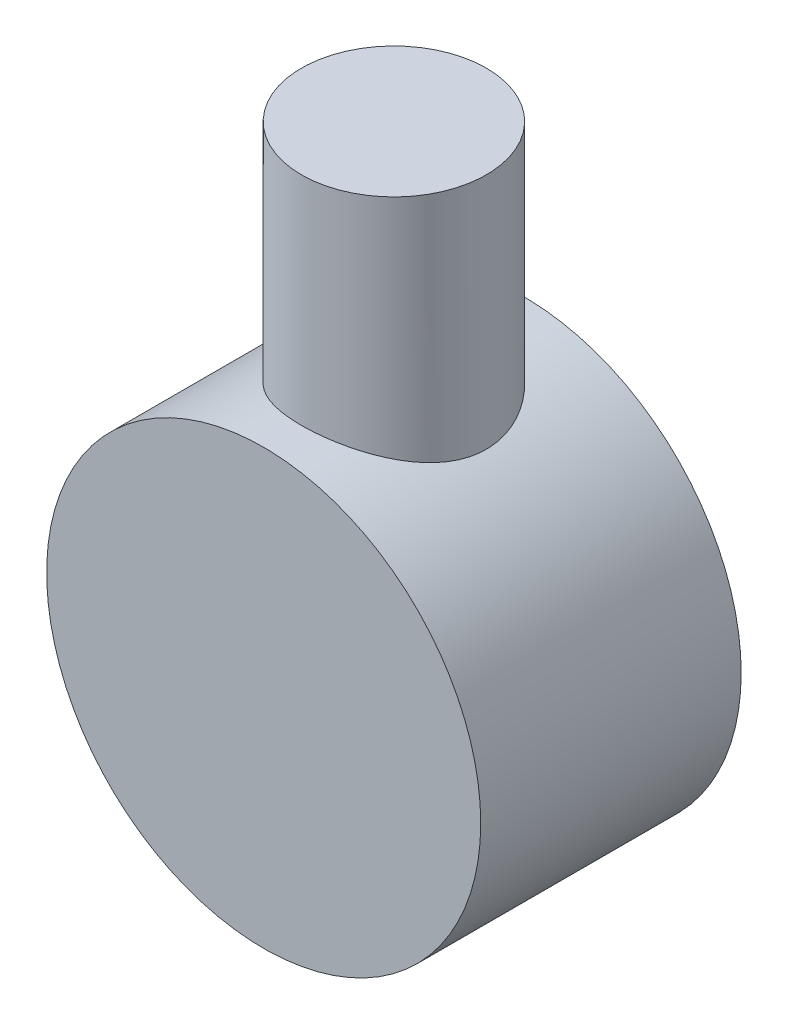
ISO-10303-21;
HEADER;
FILE_DESCRIPTION(('STEP AP214'),'2;1');
FILE_NAME('part.step','',(''),(''),'','','');
FILE_SCHEMA(('AUTOMOTIVE_DESIGN { 1 0 10303 214 1 1 1 1 }'));
ENDSEC;
DATA;
#1=APPLICATION_CONTEXT('core data for automotive mechanical design processes');
#2=APPLICATION_PROTOCOL_DEFINITION('international standard','automotive_design',2000,#1);
#3=PRODUCT_CONTEXT('',#1,'mechanical');
#4=PRODUCT('Part','Part','',(#3));
#5=PRODUCT_RELATED_PRODUCT_CATEGORY('part','',(#4));
#6=PRODUCT_DEFINITION_FORMATION('','',#4);
#7=PRODUCT_DEFINITION_CONTEXT('part definition',#1,'design');
#8=PRODUCT_DEFINITION('design','',#6,#7);
#9=PRODUCT_DEFINITION_SHAPE('','',#8);
#10=(LENGTH_UNIT() NAMED_UNIT(*) SI_UNIT(.MILLI.,.METRE.));
#11=(NAMED_UNIT(*) PLANE_ANGLE_UNIT() SI_UNIT($,.RADIAN.));
#12=(NAMED_UNIT(*) SI_UNIT($,.STERADIAN.) SOLID_ANGLE_UNIT());
#13=UNCERTAINTY_MEASURE_WITH_UNIT(LENGTH_MEASURE(1.E-05),#10,'distance_accuracy_value','');
#14=(GEOMETRIC_REPRESENTATION_CONTEXT(3) GLOBAL_UNCERTAINTY_ASSIGNED_CONTEXT((#13)) GLOBAL_UNIT_ASSIGNED_CONTEXT((#10,
#11,#12)) REPRESENTATION_CONTEXT('',''));
#15=CARTESIAN_POINT('',(0.,0.,0.));
#16=DIRECTION('',(0.,0.,1.));
#17=DIRECTION('',(1.,0.,0.));
#18=AXIS2_PLACEMENT_3D('',#15,#16,#17);
#19=CARTESIAN_POINT('',(0.,0.,14.9999999999997));
#20=DIRECTION('',(0.,0.,-1.));
#21=DIRECTION('',(-1.,0.,0.));
#22=AXIS2_PLACEMENT_3D('',#19,#20,#21);
#23=CYLINDRICAL_SURFACE('',#22,25.);
#24=CARTESIAN_POINT('',(0.,0.,14.9999999999997));
#25=DIRECTION('',(0.,0.,1.));
#26=DIRECTION('',(1.,0.,0.));
#27=AXIS2_PLACEMENT_3D('',#24,#25,#26);
#28=CIRCLE('',#27,25.);
#29=CARTESIAN_POINT('',(25.0000000000001,0.,14.9999999999997));
#30=VERTEX_POINT('',#29);
#31=EDGE_CURVE('E41',#30,#30,#28,.T.);
#32=ORIENTED_EDGE('',*,*,#31,.F.);
#33=EDGE_LOOP('',(#32));
#34=FACE_BOUND('',#33,.T.);
#35=CARTESIAN_POINT('',(0.,0.,-15.0000000000006));
#36=DIRECTION('',(0.,0.,1.));
#37=DIRECTION('',(1.,0.,0.));
#38=AXIS2_PLACEMENT_3D('',#35,#36,#37);
#39=CIRCLE('',#38,25.);
#40=CARTESIAN_POINT('',(25.,0.,-15.0000000000006));
#41=VERTEX_POINT('',#40);
#42=EDGE_CURVE('E45',#41,#41,#39,.T.);
#43=ORIENTED_EDGE('',*,*,#42,.T.);
#44=EDGE_LOOP('',(#43));
#45=FACE_BOUND('',#44,.T.);
#46=CARTESIAN_POINT('',(0.,25.,-10.65));
#47=CARTESIAN_POINT('',(-0.28480082045663,24.9999983449494,-10.6499979652172));
#48=CARTESIAN_POINT('',(-0.569690122829402,24.9951201573628,-10.6385605413435));
#49=CARTESIAN_POINT('',(-1.13743303456906,24.9757286508774,-10.5929191668898));
#50=CARTESIAN_POINT('',(-1.4202852896326,24.961209430016,-10.5587012707279));
#51=CARTESIAN_POINT('',(-1.98234730921609,24.922877129617,-10.4677604321392));
#52=CARTESIAN_POINT('',(-2.26154784414282,24.8990439631616,-10.4109888448891));
#53=CARTESIAN_POINT('',(-2.8136929160409,24.8427084308792,-10.2755268411362));
#54=CARTESIAN_POINT('',(-3.0866370142381,24.8102054590321,-10.1968348923818));
#55=CARTESIAN_POINT('',(-3.62347292694549,24.7374930288617,-10.0186152773121));
#56=CARTESIAN_POINT('',(-3.88739345174709,24.6973113543204,-9.91916261300438));
#57=CARTESIAN_POINT('',(-4.40558065313478,24.610158470209,-9.70012841639593));
#58=CARTESIAN_POINT('',(-4.65984699974608,24.5631870288315,-9.58054619683513));
#59=CARTESIAN_POINT('',(-5.15714036496397,24.4636093086832,-9.32227790698889));
#60=CARTESIAN_POINT('',(-5.40017339092128,24.4110060927777,-9.18360220915464));
#61=CARTESIAN_POINT('',(-5.8739554008633,24.301353940405,-8.88803357739726));
#62=CARTESIAN_POINT('',(-6.10469983689489,24.2443033769766,-8.73113396628662));
#63=CARTESIAN_POINT('',(-6.56323386494575,24.1243184225773,-8.39234780183619));
#64=CARTESIAN_POINT('',(-6.79037168570729,24.061233450217,-8.2096321369192));
#65=CARTESIAN_POINT('',(-7.22872686021151,23.9331920175492,-7.82641712663431));
#66=CARTESIAN_POINT('',(-7.4399368958817,23.8682347157114,-7.62590969776611));
#67=CARTESIAN_POINT('',(-7.84527439428618,23.7380917108658,-7.2082507378595));
#68=CARTESIAN_POINT('',(-8.03939643536433,23.6729059421428,-6.99109396493454));
#69=CARTESIAN_POINT('',(-8.40940067971646,23.5440091780851,-6.54135124895485));
#70=CARTESIAN_POINT('',(-8.58528285923499,23.4802981846711,-6.30876528580591));
#71=CARTESIAN_POINT('',(-8.92644686586133,23.3528034539,-5.81680909742013));
#72=CARTESIAN_POINT('',(-9.09069216375339,23.2891904169686,-5.55667415740756));
#73=CARTESIAN_POINT('',(-9.39647987675609,23.1675041484585,-5.02228940073107));
#74=CARTESIAN_POINT('',(-9.53803171225641,23.109428622256,-4.74804550367704));
#75=CARTESIAN_POINT('',(-9.79724414910827,23.000734112894,-4.18711579173537));
#76=CARTESIAN_POINT('',(-9.91490933508271,22.9501136993695,-3.90043237723959));
#77=CARTESIAN_POINT('',(-10.1251708603486,22.8581299448042,-3.31657432665764));
#78=CARTESIAN_POINT('',(-10.2177691617796,22.816765879256,-3.01940051377923));
#79=CARTESIAN_POINT('',(-10.3728708800685,22.7466576201908,-2.43181786436817));
#80=CARTESIAN_POINT('',(-10.4366404513379,22.7173887321683,-2.14180594469496));
#81=CARTESIAN_POINT('',(-10.5398189586227,22.6697036028745,-1.55659244153788));
#82=CARTESIAN_POINT('',(-10.579228677323,22.6512870129187,-1.26139102510658));
#83=CARTESIAN_POINT('',(-10.6331730774301,22.6260142736006,-0.668378861729693));
#84=CARTESIAN_POINT('',(-10.6477203138962,22.6191522894179,-0.370569508156249));
#85=CARTESIAN_POINT('',(-10.6517839563991,22.6172392318722,0.225249718996204));
#86=CARTESIAN_POINT('',(-10.6413017716573,22.6221874935615,0.523259580341676));
#87=CARTESIAN_POINT('',(-10.5973156552068,22.6428225999646,1.09281879354427));
#88=CARTESIAN_POINT('',(-10.565748529109,22.6576056271132,1.3645533124666));
#89=CARTESIAN_POINT('',(-10.4819365705688,22.6965006033984,1.90423116357528));
#90=CARTESIAN_POINT('',(-10.4296846527555,22.7206157490963,2.17217316406398));
#91=CARTESIAN_POINT('',(-10.3050506822495,22.7774144345569,2.70232687055717));
#92=CARTESIAN_POINT('',(-10.2326732893366,22.8100959907835,2.96453988788995));
#93=CARTESIAN_POINT('',(-10.0684271352504,22.8830689417973,3.48180183179365));
#94=CARTESIAN_POINT('',(-9.97655072122066,22.923363323736,3.73684790088902));
#95=CARTESIAN_POINT('',(-9.7719373205044,23.0113427840502,4.24358148685548));
#96=CARTESIAN_POINT('',(-9.65879849423792,23.059166732807,4.49508243145863));
#97=CARTESIAN_POINT('',(-9.41382707080858,23.160255094544,4.98779445668653));
#98=CARTESIAN_POINT('',(-9.28198640549736,23.2135218528148,5.2290010374956));
#99=CARTESIAN_POINT('',(-9.00051962371854,23.3240970515751,5.69985861448961));
#100=CARTESIAN_POINT('',(-8.85089162540901,23.3814059194453,5.92950838433685));
#101=CARTESIAN_POINT('',(-8.53474421455232,23.4986502499242,6.37616780355773));
#102=CARTESIAN_POINT('',(-8.36822381152069,23.5585858664349,6.59317671055985));
#103=CARTESIAN_POINT('',(-8.00363559878916,23.6850643692029,7.03227041211603));
#104=CARTESIAN_POINT('',(-7.80407910971447,23.7517206198665,7.25308859014697));
#105=CARTESIAN_POINT('',(-7.3872076056481,23.8846605182982,7.67724321919915));
#106=CARTESIAN_POINT('',(-7.16989814998001,23.9509442758155,7.88058510228474));
#107=CARTESIAN_POINT('',(-6.71851167731041,24.081462206841,8.2687824549653));
#108=CARTESIAN_POINT('',(-6.48442396891457,24.1456950351007,8.4536259540674));
#109=CARTESIAN_POINT('',(-6.00099369310801,24.2703595937243,8.80338264593593));
#110=CARTESIAN_POINT('',(-5.75165730206881,24.3307928432277,8.96830382861327));
#111=CARTESIAN_POINT('',(-5.23254239498193,24.4477618784432,9.28100888149248));
#112=CARTESIAN_POINT('',(-4.96240527372499,24.5041594667439,9.42825028448104));
#113=CARTESIAN_POINT('',(-4.40923029141242,24.6097127776006,9.69928083780417));
#114=CARTESIAN_POINT('',(-4.12619207572899,24.6588683009279,9.82306934297804));
#115=CARTESIAN_POINT('',(-3.54934605443356,24.7484804905047,10.045904321111));
#116=CARTESIAN_POINT('',(-3.25554334649923,24.7889412135379,10.1449623362244));
#117=CARTESIAN_POINT('',(-2.65931120308579,24.8599711175773,10.3173077152784));
#118=CARTESIAN_POINT('',(-2.35688245884108,24.8905410887544,10.3905971379087));
#119=CARTESIAN_POINT('',(-1.76593159492777,24.9391970676284,10.5065992950524));
#120=CARTESIAN_POINT('',(-1.4777966533061,24.9579698090517,10.5510008351314));
#121=CARTESIAN_POINT('',(-0.898384928737083,24.9855358857913,10.6160433867307));
#122=CARTESIAN_POINT('',(-0.607108283216142,24.9943296558413,10.6366854333334));
#123=CARTESIAN_POINT('',(-0.0237923234904695,25.0016898300147,10.6539689584089));
#124=CARTESIAN_POINT('',(0.268246770905948,25.0002589130455,10.6506167234752));
#125=CARTESIAN_POINT('',(0.850831830516197,24.9872161490559,10.6199653814911));
#126=CARTESIAN_POINT('',(1.14137783157648,24.9756045476148,10.5926668520747));
#127=CARTESIAN_POINT('',(1.7035313792048,24.9433970346997,10.5164952279722));
#128=CARTESIAN_POINT('',(1.9753326328781,24.9233045783723,10.4688294991297));
#129=CARTESIAN_POINT('',(2.51369453045569,24.8747740504968,10.3527611011835));
#130=CARTESIAN_POINT('',(2.78025540294315,24.8463363438307,10.2843593387234));
#131=CARTESIAN_POINT('',(3.30640695237081,24.7818062911766,10.1274642294522));
#132=CARTESIAN_POINT('',(3.56599832943102,24.7457147173231,10.0389729092442));
#133=CARTESIAN_POINT('',(4.0767793340579,24.6667123593851,9.8426253566696));
#134=CARTESIAN_POINT('',(4.32796570131549,24.6237989653945,9.73476171074028));
#135=CARTESIAN_POINT('',(4.82804574012865,24.5307279116497,9.49691850463282));
#136=CARTESIAN_POINT('',(5.07663044653987,24.480387821123,9.36636004174081));
#137=CARTESIAN_POINT('',(5.56198088545438,24.3747035103592,9.0865516250046));
#138=CARTESIAN_POINT('',(5.79874221435454,24.3193574469128,8.93729477852458));
#139=CARTESIAN_POINT('',(6.48937347505461,24.1477232115472,8.46298951917594));
#140=CARTESIAN_POINT('',(6.92387279279413,24.025784270036,8.11127140862209));
#141=CARTESIAN_POINT('',(7.76225860635631,23.7687613291557,7.31627727974415));
#142=CARTESIAN_POINT('',(8.16144966612376,23.6333749833471,6.86813100701155));
#143=CARTESIAN_POINT('',(8.70038440717568,23.4380036417076,6.14945535764526));
#144=CARTESIAN_POINT('',(8.87014924659117,23.3741236614347,5.90196958688981));
#145=CARTESIAN_POINT('',(9.1885966050555,23.2507806098467,5.39279461411242));
#146=CARTESIAN_POINT('',(9.33728805425391,23.1913156727112,5.13111149382034));
#147=CARTESIAN_POINT('',(9.61487823485816,23.0776307274812,4.59027843592778));
#148=CARTESIAN_POINT('',(9.74338030949302,23.0235221087571,4.3109014028255));
#149=CARTESIAN_POINT('',(9.97611269832019,22.9236387995084,3.74090557175076));
#150=CARTESIAN_POINT('',(10.0803542555764,22.8778602507295,3.45029205421692));
#151=CARTESIAN_POINT('',(10.2634607130316,22.7963030421823,2.85995299246988));
#152=CARTESIAN_POINT('',(10.3423380299073,22.7605194906463,2.56023198558186));
#153=CARTESIAN_POINT('',(10.4738104491395,22.7003203884786,1.95396367964157));
#154=CARTESIAN_POINT('',(10.5264081845075,22.6759036989918,1.64741706767834));
#155=CARTESIAN_POINT('',(10.6015031268114,22.6408854414809,1.0547997807587));
#156=CARTESIAN_POINT('',(10.6260658471186,22.629337628013,0.7690451787945));
#157=CARTESIAN_POINT('',(10.6520493880779,22.6171187199171,0.19625893868947));
#158=CARTESIAN_POINT('',(10.653471491423,22.6164470224218,-0.0907726277865286));
#159=CARTESIAN_POINT('',(10.6331591814101,22.6260037798928,-0.663783266977009));
#160=CARTESIAN_POINT('',(10.6114283136504,22.6362305658876,-0.949762494115748));
#161=CARTESIAN_POINT('',(10.5450796829602,22.6672148815085,-1.51846954307691));
#162=CARTESIAN_POINT('',(10.5004621559457,22.6879723025845,-1.80119739838382));
#163=CARTESIAN_POINT('',(10.3917167737787,22.7379770166804,-2.34694330464873));
#164=CARTESIAN_POINT('',(10.3287037420694,22.766735684546,-2.61022975267285));
#165=CARTESIAN_POINT('',(10.1831221381624,22.8322226266993,-3.1304147293176));
#166=CARTESIAN_POINT('',(10.1005468423859,22.8689536407295,-3.38731102801473));
#167=CARTESIAN_POINT('',(9.91657105610508,22.9493286395339,-3.89314163925));
#168=CARTESIAN_POINT('',(9.81517069148864,22.9929725780795,-4.14207600501849));
#169=CARTESIAN_POINT('',(9.59431978150539,23.0859996281839,-4.63070460211073));
#170=CARTESIAN_POINT('',(9.47486754632403,23.1353832769303,-4.87039796575584));
#171=CARTESIAN_POINT('',(9.2108402151284,23.241813672397,-5.35381817561743));
#172=CARTESIAN_POINT('',(9.06517132085725,23.2991450005963,-5.59688518051122));
#173=CARTESIAN_POINT('',(8.75538863887271,23.4173150827886,-6.07006140898955));
#174=CARTESIAN_POINT('',(8.5912742590003,23.4781539493542,-6.3001702162184));
#175=CARTESIAN_POINT('',(8.2455186282227,23.6018036257617,-6.74637742216209));
#176=CARTESIAN_POINT('',(8.06387173393529,23.6646150661192,-6.96247127205678));
#177=CARTESIAN_POINT('',(7.68407556017134,23.7906497210889,-7.37950055967452));
#178=CARTESIAN_POINT('',(7.48592609670551,23.8538729402847,-7.58043582834497));
#179=CARTESIAN_POINT('',(7.05806702641689,23.9841092763825,-7.98114331543172));
#180=CARTESIAN_POINT('',(6.82710134288336,24.0510340169541,-8.17960586961062));
#181=CARTESIAN_POINT('',(6.34855336873441,24.1817569341421,-8.55634713371776));
#182=CARTESIAN_POINT('',(6.10097650163081,24.2455561195874,-8.73463238090026));
#183=CARTESIAN_POINT('',(5.59039432965023,24.3683497950599,-9.06991333426218));
#184=CARTESIAN_POINT('',(5.32737802286736,24.4273407855587,-9.22689358841979));
#185=CARTESIAN_POINT('',(4.78772847372873,24.5388171254531,-9.51809562375895));
#186=CARTESIAN_POINT('',(4.5110963273859,24.5913029972886,-9.65231923289332));
#187=CARTESIAN_POINT('',(3.95026580487382,24.6875501676629,-9.89494072685919));
#188=CARTESIAN_POINT('',(3.66624136145467,24.731429710653,-10.0036933133214));
#189=CARTESIAN_POINT('',(3.08880773807997,24.8101620247008,-10.1967846926032));
#190=CARTESIAN_POINT('',(2.79539954056526,24.8450157372728,-10.2811260319493));
#191=CARTESIAN_POINT('',(2.20224717673394,24.9045925811303,-10.4242724877216));
#192=CARTESIAN_POINT('',(1.90252186634731,24.9293423201916,-10.4831446992368));
#193=CARTESIAN_POINT('',(1.29858778125385,24.9680814327162,-10.5749391915412));
#194=CARTESIAN_POINT('',(0.994382400594159,24.9820785638848,-10.607880181405));
#195=CARTESIAN_POINT('',(0.574583000664477,24.9936604386289,-10.6351110952527));
#196=CARTESIAN_POINT('',(0.459755565429395,24.996036310915,-10.6406927272508));
#197=CARTESIAN_POINT('',(0.2299568950219,24.9992064299891,-10.6481376004561));
#198=CARTESIAN_POINT('',(0.114985659074044,25.0000006682111,-10.6500008215245));
#199=CARTESIAN_POINT('',(0.,25.,-10.65));
#200=B_SPLINE_CURVE_WITH_KNOTS('',3,(#46,#47,#48,#49,#50,#51,#52,#53,#54,#55,#56,#57,#58,#59,
#60,#61,#62,#63,#64,#65,#66,#67,#68,#69,#70,#71,#72,#73,#74,#75,#76,#77,#78,#79,#80,#81,#82,#83,
#84,#85,#86,#87,#88,#89,#90,#91,#92,#93,#94,#95,#96,#97,#98,#99,#100,#101,#102,#103,#104,#105,
#106,#107,#108,#109,#110,#111,#112,#113,#114,#115,#116,#117,#118,#119,#120,#121,#122,#123,#124,
#125,#126,#127,#128,#129,#130,#131,#132,#133,#134,#135,#136,#137,#138,#139,#140,#141,#142,#143,
#144,#145,#146,#147,#148,#149,#150,#151,#152,#153,#154,#155,#156,#157,#158,#159,#160,#161,#162,
#163,#164,#165,#166,#167,#168,#169,#170,#171,#172,#173,#174,#175,#176,#177,#178,#179,#180,#181,
#182,#183,#184,#185,#186,#187,#188,#189,#190,#191,#192,#193,#194,#195,#196,#197,#198,#199),
.UNSPECIFIED.,.T.,.F.,(4,2,2,2,2,2,2,2,2,2,2,2,2,2,2,2,2,2,2,2,2,2,2,2,2,2,2,2,2,2,2,2,2,2,2,2,
2,2,2,2,2,2,2,2,2,2,2,2,2,2,2,2,2,2,2,2,2,2,2,2,2,2,2,2,2,2,2,2,2,2,2,2,2,2,2,2,4),(0.,
0.854286014607618,1.70909548122019,2.56575873737658,3.42248189004126,4.2761619338062,
5.12987112969246,5.98311836821109,6.83667922606612,7.73046741912595,8.62466379527626,
9.51914286590196,10.4136231014751,11.3549167891461,12.2958187145206,13.2365398791981,
14.1771873865258,15.0711223134626,15.9650285166737,16.8584831814991,17.75188754369,
18.572807959791,19.3940098177148,20.2150216956179,21.0363563970971,21.8751464157531,
22.7142994030536,23.5535412491519,24.3928323325868,25.3068063867446,26.2204953199484,
27.1347717384436,28.0486802573514,28.9858299467525,29.9230054122604,30.8597426603648,
31.7964050541731,32.6716954095963,33.5469476315472,34.4219705424608,35.2969723465953,
36.1260559033649,36.9551032152644,37.784066931298,38.6133485606483,39.4681750832604,
40.3233176460909,42.0326609688267,43.8694077425657,44.7890352991241,45.7082719776396,
46.6437696840891,47.5788329852186,48.5134378410602,49.4479490379126,50.3079535783624,
51.1679104482756,52.0277356450894,52.8875519789894,53.7033838388878,54.5194965092474,
55.3356037222582,56.151787377489,57.0182086502097,57.8846577457696,58.7513866708032,
59.6181252604039,60.5523749115741,61.4863210029992,62.4209408849228,63.3554856568594,
64.2761186707241,65.1966556115759,66.1147525283499,67.0321864402311,67.3770945351606,
67.7220044980953),.UNSPECIFIED.);
#201=CARTESIAN_POINT('',(0.,25.,-10.65));
#202=VERTEX_POINT('',#201);
#203=EDGE_CURVE('E10',#202,#202,#200,.T.);
#204=ORIENTED_EDGE('',*,*,#203,.F.);
#205=EDGE_LOOP('',(#204));
#206=FACE_BOUND('',#205,.T.);
#207=ADVANCED_FACE('F30',(#34,#45,#206),#23,.T.);
#208=CARTESIAN_POINT('',(0.,0.,14.9999999999997));
#209=DIRECTION('',(0.,0.,1.));
#210=DIRECTION('',(1.,0.,0.));
#211=AXIS2_PLACEMENT_3D('',#208,#209,#210);
#212=PLANE('',#211);
#213=ORIENTED_EDGE('',*,*,#31,.T.);
#214=EDGE_LOOP('',(#213));
#215=FACE_BOUND('',#214,.T.);
#216=ADVANCED_FACE('F65',(#215),#212,.T.);
#217=CARTESIAN_POINT('',(0.,0.,-15.0000000000006));
#218=DIRECTION('',(0.,0.,1.));
#219=DIRECTION('',(1.,0.,0.));
#220=AXIS2_PLACEMENT_3D('',#217,#218,#219);
#221=PLANE('',#220);
#222=ORIENTED_EDGE('',*,*,#42,.F.);
#223=EDGE_LOOP('',(#222));
#224=FACE_BOUND('',#223,.T.);
#225=ADVANCED_FACE('F59',(#224),#221,.F.);
#226=CARTESIAN_POINT('',(0.,50.,0.));
#227=DIRECTION('',(0.,-1.,0.));
#228=DIRECTION('',(0.,0.,-1.));
#229=AXIS2_PLACEMENT_3D('',#226,#227,#228);
#230=CYLINDRICAL_SURFACE('',#229,10.65);
#231=CARTESIAN_POINT('',(0.,50.,0.));
#232=DIRECTION('',(0.,1.,0.));
#233=DIRECTION('',(0.,0.,1.));
#234=AXIS2_PLACEMENT_3D('',#231,#232,#233);
#235=CIRCLE('',#234,10.65);
#236=CARTESIAN_POINT('',(0.,50.,10.65));
#237=VERTEX_POINT('',#236);
#238=EDGE_CURVE('E50',#237,#237,#235,.T.);
#239=ORIENTED_EDGE('',*,*,#238,.F.);
#240=EDGE_LOOP('',(#239));
#241=FACE_BOUND('',#240,.T.);
#242=ORIENTED_EDGE('',*,*,#203,.T.);
#243=EDGE_LOOP('',(#242));
#244=FACE_BOUND('',#243,.T.);
#245=ADVANCED_FACE('F57',(#241,#244),#230,.T.);
#246=CARTESIAN_POINT('',(0.,50.,0.));
#247=DIRECTION('',(0.,1.,0.));
#248=DIRECTION('',(0.,0.,1.));
#249=AXIS2_PLACEMENT_3D('',#246,#247,#248);
#250=PLANE('',#249);
#251=ORIENTED_EDGE('',*,*,#238,.T.);
#252=EDGE_LOOP('',(#251));
#253=FACE_BOUND('',#252,.T.);
#254=ADVANCED_FACE('F55',(#253),#250,.T.);
#255=CLOSED_SHELL('',(#207,#216,#225,#245,#254));
#256=MANIFOLD_SOLID_BREP('B2',#255);
#257=ADVANCED_BREP_SHAPE_REPRESENTATION('',(#18,#256),#14);
#258=SHAPE_DEFINITION_REPRESENTATION(#9,#257);
ENDSEC;
END-ISO-10303-21;
